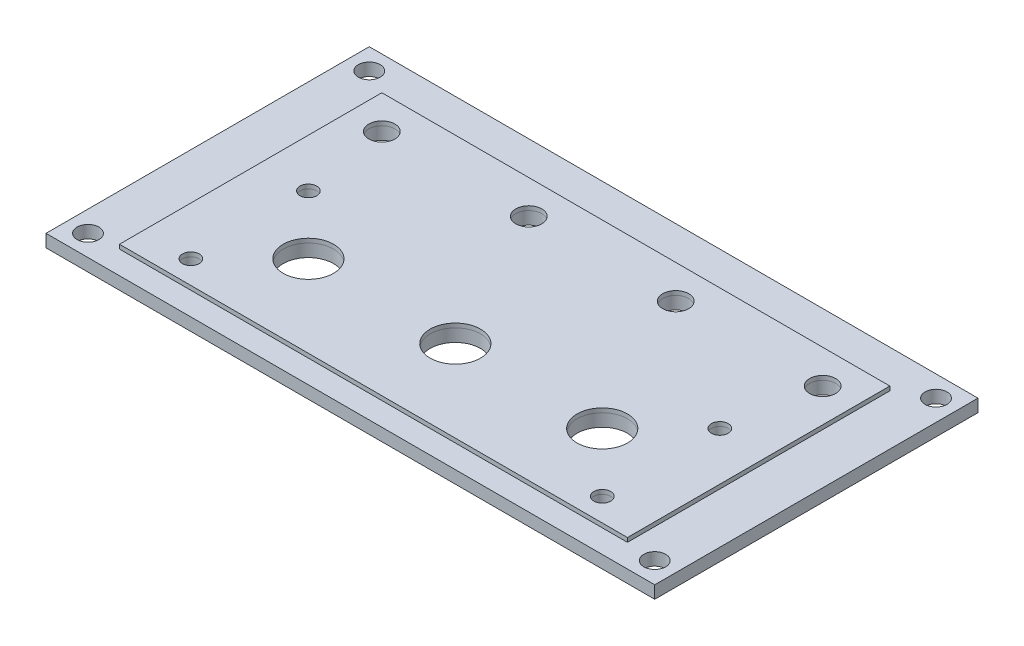
ISO-10303-21;
HEADER;
FILE_DESCRIPTION(('STEP AP214'),'2;1');
FILE_NAME('part.step','',(''),(''),'','','');
FILE_SCHEMA(('AUTOMOTIVE_DESIGN { 1 0 10303 214 1 1 1 1 }'));
ENDSEC;
DATA;
#1=APPLICATION_CONTEXT('core data for automotive mechanical design processes');
#2=APPLICATION_PROTOCOL_DEFINITION('international standard','automotive_design',2000,#1);
#3=PRODUCT_CONTEXT('',#1,'mechanical');
#4=PRODUCT('Part','Part','',(#3));
#5=PRODUCT_RELATED_PRODUCT_CATEGORY('part','',(#4));
#6=PRODUCT_DEFINITION_FORMATION('','',#4);
#7=PRODUCT_DEFINITION_CONTEXT('part definition',#1,'design');
#8=PRODUCT_DEFINITION('design','',#6,#7);
#9=PRODUCT_DEFINITION_SHAPE('','',#8);
#10=(LENGTH_UNIT() NAMED_UNIT(*) SI_UNIT(.MILLI.,.METRE.));
#11=(NAMED_UNIT(*) PLANE_ANGLE_UNIT() SI_UNIT($,.RADIAN.));
#12=(NAMED_UNIT(*) SI_UNIT($,.STERADIAN.) SOLID_ANGLE_UNIT());
#13=UNCERTAINTY_MEASURE_WITH_UNIT(LENGTH_MEASURE(1.E-05),#10,'distance_accuracy_value','');
#14=(GEOMETRIC_REPRESENTATION_CONTEXT(3) GLOBAL_UNCERTAINTY_ASSIGNED_CONTEXT((#13)) GLOBAL_UNIT_ASSIGNED_CONTEXT((#10,
#11,#12)) REPRESENTATION_CONTEXT('',''));
#15=CARTESIAN_POINT('',(0.,0.,0.));
#16=DIRECTION('',(0.,0.,1.));
#17=DIRECTION('',(1.,0.,0.));
#18=AXIS2_PLACEMENT_3D('',#15,#16,#17);
#19=CARTESIAN_POINT('',(0.,4.,0.));
#20=DIRECTION('',(0.,1.,0.));
#21=DIRECTION('',(0.,0.,1.));
#22=AXIS2_PLACEMENT_3D('',#19,#20,#21);
#23=PLANE('',#22);
#24=CARTESIAN_POINT('',(23.5,4.,-39.));
#25=DIRECTION('',(0.,1.,0.));
#26=DIRECTION('',(0.,0.,1.));
#27=AXIS2_PLACEMENT_3D('',#24,#25,#26);
#28=CIRCLE('',#27,2.);
#29=CARTESIAN_POINT('',(23.5,4.,-37.));
#30=VERTEX_POINT('',#29);
#31=EDGE_CURVE('E179',#30,#30,#28,.T.);
#32=ORIENTED_EDGE('',*,*,#31,.F.);
#33=EDGE_LOOP('',(#32));
#34=FACE_BOUND('',#33,.T.);
#35=CARTESIAN_POINT('',(72.5,4.,-25.));
#36=DIRECTION('',(0.,1.,0.));
#37=DIRECTION('',(0.,0.,1.));
#38=AXIS2_PLACEMENT_3D('',#35,#36,#37);
#39=CIRCLE('',#38,6.);
#40=CARTESIAN_POINT('',(72.5,4.,-19.));
#41=VERTEX_POINT('',#40);
#42=EDGE_CURVE('E167',#41,#41,#39,.T.);
#43=ORIENTED_EDGE('',*,*,#42,.F.);
#44=EDGE_LOOP('',(#43));
#45=FACE_BOUND('',#44,.T.);
#46=CARTESIAN_POINT('',(121.5,4.,-39.));
#47=DIRECTION('',(0.,1.,0.));
#48=DIRECTION('',(0.,0.,1.));
#49=AXIS2_PLACEMENT_3D('',#46,#47,#48);
#50=CIRCLE('',#49,1.99999999999999);
#51=CARTESIAN_POINT('',(121.5,4.,-37.));
#52=VERTEX_POINT('',#51);
#53=EDGE_CURVE('E155',#52,#52,#50,.T.);
#54=ORIENTED_EDGE('',*,*,#53,.F.);
#55=EDGE_LOOP('',(#54));
#56=FACE_BOUND('',#55,.T.);
#57=CARTESIAN_POINT('',(125.,4.,-60.));
#58=DIRECTION('',(0.,1.,0.));
#59=DIRECTION('',(0.,0.,1.));
#60=AXIS2_PLACEMENT_3D('',#57,#58,#59);
#61=CIRCLE('',#60,3.09999999999996);
#62=CARTESIAN_POINT('',(125.,4.,-56.9));
#63=VERTEX_POINT('',#62);
#64=EDGE_CURVE('E143',#63,#63,#61,.T.);
#65=ORIENTED_EDGE('',*,*,#64,.F.);
#66=EDGE_LOOP('',(#65));
#67=FACE_BOUND('',#66,.T.);
#68=CARTESIAN_POINT('',(55.,4.,-60.));
#69=DIRECTION('',(0.,1.,0.));
#70=DIRECTION('',(0.,0.,1.));
#71=AXIS2_PLACEMENT_3D('',#68,#69,#70);
#72=CIRCLE('',#71,3.1);
#73=CARTESIAN_POINT('',(55.,4.,-56.9));
#74=VERTEX_POINT('',#73);
#75=EDGE_CURVE('E131',#74,#74,#72,.T.);
#76=ORIENTED_EDGE('',*,*,#75,.F.);
#77=EDGE_LOOP('',(#76));
#78=FACE_BOUND('',#77,.T.);
#79=DIRECTION('',(0.,0.,1.));
#80=VECTOR('',#79,1.);
#81=CARTESIAN_POINT('',(12.,4.,-68.));
#82=LINE('',#81,#80);
#83=CARTESIAN_POINT('',(12.,4.,-68.));
#84=VERTEX_POINT('',#83);
#85=CARTESIAN_POINT('',(12.,4.,-5.5));
#86=VERTEX_POINT('',#85);
#87=EDGE_CURVE('E101',#84,#86,#82,.T.);
#88=ORIENTED_EDGE('',*,*,#87,.T.);
#89=DIRECTION('',(1.,0.,0.));
#90=VECTOR('',#89,1.);
#91=CARTESIAN_POINT('',(12.,4.,-5.5));
#92=LINE('',#91,#90);
#93=CARTESIAN_POINT('',(133.,4.,-5.5));
#94=VERTEX_POINT('',#93);
#95=EDGE_CURVE('E96',#86,#94,#92,.T.);
#96=ORIENTED_EDGE('',*,*,#95,.T.);
#97=DIRECTION('',(0.,0.,-1.));
#98=VECTOR('',#97,1.);
#99=CARTESIAN_POINT('',(133.,4.,-68.));
#100=LINE('',#99,#98);
#101=CARTESIAN_POINT('',(133.,4.,-68.));
#102=VERTEX_POINT('',#101);
#103=EDGE_CURVE('E99',#94,#102,#100,.T.);
#104=ORIENTED_EDGE('',*,*,#103,.T.);
#105=DIRECTION('',(-1.,0.,0.));
#106=VECTOR('',#105,1.);
#107=CARTESIAN_POINT('',(12.,4.,-68.));
#108=LINE('',#107,#106);
#109=EDGE_CURVE('E66',#102,#84,#108,.T.);
#110=ORIENTED_EDGE('',*,*,#109,.T.);
#111=EDGE_LOOP('',(#88,#96,#104,#110));
#112=FACE_BOUND('',#111,.T.);
#113=CARTESIAN_POINT('',(20.,4.,-60.));
#114=DIRECTION('',(0.,1.,0.));
#115=DIRECTION('',(0.,0.,1.));
#116=AXIS2_PLACEMENT_3D('',#113,#114,#115);
#117=CIRCLE('',#116,3.09999999999999);
#118=CARTESIAN_POINT('',(20.,4.,-56.9));
#119=VERTEX_POINT('',#118);
#120=EDGE_CURVE('E116',#119,#119,#117,.T.);
#121=ORIENTED_EDGE('',*,*,#120,.F.);
#122=EDGE_LOOP('',(#121));
#123=FACE_BOUND('',#122,.T.);
#124=CARTESIAN_POINT('',(90.,4.,-60.));
#125=DIRECTION('',(0.,1.,0.));
#126=DIRECTION('',(0.,0.,1.));
#127=AXIS2_PLACEMENT_3D('',#124,#125,#126);
#128=CIRCLE('',#127,3.09999999999999);
#129=CARTESIAN_POINT('',(90.,4.,-56.9));
#130=VERTEX_POINT('',#129);
#131=EDGE_CURVE('E137',#130,#130,#128,.T.);
#132=ORIENTED_EDGE('',*,*,#131,.F.);
#133=EDGE_LOOP('',(#132));
#134=FACE_BOUND('',#133,.T.);
#135=CARTESIAN_POINT('',(107.5,4.,-25.));
#136=DIRECTION('',(0.,1.,0.));
#137=DIRECTION('',(0.,0.,1.));
#138=AXIS2_PLACEMENT_3D('',#135,#136,#137);
#139=CIRCLE('',#138,6.00000000000002);
#140=CARTESIAN_POINT('',(107.5,4.,-19.));
#141=VERTEX_POINT('',#140);
#142=EDGE_CURVE('E149',#141,#141,#139,.T.);
#143=ORIENTED_EDGE('',*,*,#142,.F.);
#144=EDGE_LOOP('',(#143));
#145=FACE_BOUND('',#144,.T.);
#146=CARTESIAN_POINT('',(121.5,4.,-11.));
#147=DIRECTION('',(0.,1.,0.));
#148=DIRECTION('',(0.,0.,1.));
#149=AXIS2_PLACEMENT_3D('',#146,#147,#148);
#150=CIRCLE('',#149,2.);
#151=CARTESIAN_POINT('',(121.5,4.,-9.00000000000003));
#152=VERTEX_POINT('',#151);
#153=EDGE_CURVE('E161',#152,#152,#150,.T.);
#154=ORIENTED_EDGE('',*,*,#153,.F.);
#155=EDGE_LOOP('',(#154));
#156=FACE_BOUND('',#155,.T.);
#157=CARTESIAN_POINT('',(37.5,4.,-25.));
#158=DIRECTION('',(0.,1.,0.));
#159=DIRECTION('',(0.,0.,1.));
#160=AXIS2_PLACEMENT_3D('',#157,#158,#159);
#161=CIRCLE('',#160,6.);
#162=CARTESIAN_POINT('',(37.5,4.,-19.));
#163=VERTEX_POINT('',#162);
#164=EDGE_CURVE('E173',#163,#163,#161,.T.);
#165=ORIENTED_EDGE('',*,*,#164,.F.);
#166=EDGE_LOOP('',(#165));
#167=FACE_BOUND('',#166,.T.);
#168=CARTESIAN_POINT('',(23.5,4.,-11.));
#169=DIRECTION('',(0.,1.,0.));
#170=DIRECTION('',(0.,0.,1.));
#171=AXIS2_PLACEMENT_3D('',#168,#169,#170);
#172=CIRCLE('',#171,2.);
#173=CARTESIAN_POINT('',(23.5,4.,-9.00000000000001));
#174=VERTEX_POINT('',#173);
#175=EDGE_CURVE('E185',#174,#174,#172,.T.);
#176=ORIENTED_EDGE('',*,*,#175,.F.);
#177=EDGE_LOOP('',(#176));
#178=FACE_BOUND('',#177,.T.);
#179=ADVANCED_FACE('F49',(#34,#45,#56,#67,#78,#112,#123,#134,#145,#156,#167,#178),#23,.T.);
#180=CARTESIAN_POINT('',(0.,3.,0.));
#181=DIRECTION('',(0.,1.,0.));
#182=DIRECTION('',(0.,0.,1.));
#183=AXIS2_PLACEMENT_3D('',#180,#181,#182);
#184=PLANE('',#183);
#185=DIRECTION('',(0.,0.,1.));
#186=VECTOR('',#185,1.);
#187=CARTESIAN_POINT('',(12.,3.,-68.));
#188=LINE('',#187,#186);
#189=CARTESIAN_POINT('',(12.,3.,-68.));
#190=VERTEX_POINT('',#189);
#191=CARTESIAN_POINT('',(12.,3.,-5.5));
#192=VERTEX_POINT('',#191);
#193=EDGE_CURVE('E113',#190,#192,#188,.T.);
#194=ORIENTED_EDGE('',*,*,#193,.F.);
#195=DIRECTION('',(-1.,0.,0.));
#196=VECTOR('',#195,1.);
#197=CARTESIAN_POINT('',(12.,3.,-68.));
#198=LINE('',#197,#196);
#199=CARTESIAN_POINT('',(133.,3.,-68.));
#200=VERTEX_POINT('',#199);
#201=EDGE_CURVE('E89',#200,#190,#198,.T.);
#202=ORIENTED_EDGE('',*,*,#201,.F.);
#203=DIRECTION('',(0.,0.,-1.));
#204=VECTOR('',#203,1.);
#205=CARTESIAN_POINT('',(133.,3.,-68.));
#206=LINE('',#205,#204);
#207=CARTESIAN_POINT('',(133.,3.,-5.5));
#208=VERTEX_POINT('',#207);
#209=EDGE_CURVE('E83',#208,#200,#206,.T.);
#210=ORIENTED_EDGE('',*,*,#209,.F.);
#211=DIRECTION('',(1.,0.,0.));
#212=VECTOR('',#211,1.);
#213=CARTESIAN_POINT('',(12.,3.,-5.5));
#214=LINE('',#213,#212);
#215=EDGE_CURVE('E105',#192,#208,#214,.T.);
#216=ORIENTED_EDGE('',*,*,#215,.F.);
#217=EDGE_LOOP('',(#194,#202,#210,#216));
#218=FACE_BOUND('',#217,.T.);
#219=CARTESIAN_POINT('',(20.,3.,-60.));
#220=DIRECTION('',(0.,1.,0.));
#221=DIRECTION('',(0.,0.,1.));
#222=AXIS2_PLACEMENT_3D('',#219,#220,#221);
#223=CIRCLE('',#222,3.09999999999999);
#224=CARTESIAN_POINT('',(20.,3.,-56.9));
#225=VERTEX_POINT('',#224);
#226=EDGE_CURVE('E128',#225,#225,#223,.T.);
#227=ORIENTED_EDGE('',*,*,#226,.T.);
#228=EDGE_LOOP('',(#227));
#229=FACE_BOUND('',#228,.T.);
#230=CARTESIAN_POINT('',(55.,3.,-60.));
#231=DIRECTION('',(0.,1.,0.));
#232=DIRECTION('',(0.,0.,1.));
#233=AXIS2_PLACEMENT_3D('',#230,#231,#232);
#234=CIRCLE('',#233,3.1);
#235=CARTESIAN_POINT('',(55.,3.,-56.9));
#236=VERTEX_POINT('',#235);
#237=EDGE_CURVE('E134',#236,#236,#234,.T.);
#238=ORIENTED_EDGE('',*,*,#237,.T.);
#239=EDGE_LOOP('',(#238));
#240=FACE_BOUND('',#239,.T.);
#241=CARTESIAN_POINT('',(90.,3.,-60.));
#242=DIRECTION('',(0.,1.,0.));
#243=DIRECTION('',(0.,0.,1.));
#244=AXIS2_PLACEMENT_3D('',#241,#242,#243);
#245=CIRCLE('',#244,3.09999999999999);
#246=CARTESIAN_POINT('',(90.,3.,-56.9));
#247=VERTEX_POINT('',#246);
#248=EDGE_CURVE('E140',#247,#247,#245,.T.);
#249=ORIENTED_EDGE('',*,*,#248,.T.);
#250=EDGE_LOOP('',(#249));
#251=FACE_BOUND('',#250,.T.);
#252=CARTESIAN_POINT('',(125.,3.,-60.));
#253=DIRECTION('',(0.,1.,0.));
#254=DIRECTION('',(0.,0.,1.));
#255=AXIS2_PLACEMENT_3D('',#252,#253,#254);
#256=CIRCLE('',#255,3.09999999999996);
#257=CARTESIAN_POINT('',(125.,3.,-56.9));
#258=VERTEX_POINT('',#257);
#259=EDGE_CURVE('E146',#258,#258,#256,.T.);
#260=ORIENTED_EDGE('',*,*,#259,.T.);
#261=EDGE_LOOP('',(#260));
#262=FACE_BOUND('',#261,.T.);
#263=CARTESIAN_POINT('',(107.5,3.,-25.));
#264=DIRECTION('',(0.,1.,0.));
#265=DIRECTION('',(0.,0.,1.));
#266=AXIS2_PLACEMENT_3D('',#263,#264,#265);
#267=CIRCLE('',#266,6.00000000000002);
#268=CARTESIAN_POINT('',(107.5,3.,-19.));
#269=VERTEX_POINT('',#268);
#270=EDGE_CURVE('E152',#269,#269,#267,.T.);
#271=ORIENTED_EDGE('',*,*,#270,.T.);
#272=EDGE_LOOP('',(#271));
#273=FACE_BOUND('',#272,.T.);
#274=CARTESIAN_POINT('',(121.5,3.,-39.));
#275=DIRECTION('',(0.,1.,0.));
#276=DIRECTION('',(0.,0.,1.));
#277=AXIS2_PLACEMENT_3D('',#274,#275,#276);
#278=CIRCLE('',#277,1.99999999999999);
#279=CARTESIAN_POINT('',(121.5,3.,-37.));
#280=VERTEX_POINT('',#279);
#281=EDGE_CURVE('E158',#280,#280,#278,.T.);
#282=ORIENTED_EDGE('',*,*,#281,.T.);
#283=EDGE_LOOP('',(#282));
#284=FACE_BOUND('',#283,.T.);
#285=CARTESIAN_POINT('',(121.5,3.,-11.));
#286=DIRECTION('',(0.,1.,0.));
#287=DIRECTION('',(0.,0.,1.));
#288=AXIS2_PLACEMENT_3D('',#285,#286,#287);
#289=CIRCLE('',#288,2.);
#290=CARTESIAN_POINT('',(121.5,3.,-9.00000000000003));
#291=VERTEX_POINT('',#290);
#292=EDGE_CURVE('E164',#291,#291,#289,.T.);
#293=ORIENTED_EDGE('',*,*,#292,.T.);
#294=EDGE_LOOP('',(#293));
#295=FACE_BOUND('',#294,.T.);
#296=CARTESIAN_POINT('',(72.5,3.,-25.));
#297=DIRECTION('',(0.,1.,0.));
#298=DIRECTION('',(0.,0.,1.));
#299=AXIS2_PLACEMENT_3D('',#296,#297,#298);
#300=CIRCLE('',#299,6.);
#301=CARTESIAN_POINT('',(72.5,3.,-19.));
#302=VERTEX_POINT('',#301);
#303=EDGE_CURVE('E170',#302,#302,#300,.T.);
#304=ORIENTED_EDGE('',*,*,#303,.T.);
#305=EDGE_LOOP('',(#304));
#306=FACE_BOUND('',#305,.T.);
#307=CARTESIAN_POINT('',(37.5,3.,-25.));
#308=DIRECTION('',(0.,1.,0.));
#309=DIRECTION('',(0.,0.,1.));
#310=AXIS2_PLACEMENT_3D('',#307,#308,#309);
#311=CIRCLE('',#310,6.);
#312=CARTESIAN_POINT('',(37.5,3.,-19.));
#313=VERTEX_POINT('',#312);
#314=EDGE_CURVE('E176',#313,#313,#311,.T.);
#315=ORIENTED_EDGE('',*,*,#314,.T.);
#316=EDGE_LOOP('',(#315));
#317=FACE_BOUND('',#316,.T.);
#318=CARTESIAN_POINT('',(23.5,3.,-39.));
#319=DIRECTION('',(0.,1.,0.));
#320=DIRECTION('',(0.,0.,1.));
#321=AXIS2_PLACEMENT_3D('',#318,#319,#320);
#322=CIRCLE('',#321,2.);
#323=CARTESIAN_POINT('',(23.5,3.,-37.));
#324=VERTEX_POINT('',#323);
#325=EDGE_CURVE('E182',#324,#324,#322,.T.);
#326=ORIENTED_EDGE('',*,*,#325,.T.);
#327=EDGE_LOOP('',(#326));
#328=FACE_BOUND('',#327,.T.);
#329=CARTESIAN_POINT('',(23.5,3.,-11.));
#330=DIRECTION('',(0.,1.,0.));
#331=DIRECTION('',(0.,0.,1.));
#332=AXIS2_PLACEMENT_3D('',#329,#330,#331);
#333=CIRCLE('',#332,2.);
#334=CARTESIAN_POINT('',(23.5,3.,-9.00000000000001));
#335=VERTEX_POINT('',#334);
#336=EDGE_CURVE('E188',#335,#335,#333,.T.);
#337=ORIENTED_EDGE('',*,*,#336,.T.);
#338=EDGE_LOOP('',(#337));
#339=FACE_BOUND('',#338,.T.);
#340=ADVANCED_FACE('F124',(#218,#229,#240,#251,#262,#273,#284,#295,#306,#317,#328,#339),#184,.F.);
#341=CARTESIAN_POINT('',(12.,4.,-68.));
#342=DIRECTION('',(1.,0.,0.));
#343=DIRECTION('',(0.,0.,-1.));
#344=AXIS2_PLACEMENT_3D('',#341,#342,#343);
#345=PLANE('',#344);
#346=ORIENTED_EDGE('',*,*,#193,.T.);
#347=DIRECTION('',(0.,-1.,0.));
#348=VECTOR('',#347,1.);
#349=CARTESIAN_POINT('',(12.,4.,-5.5));
#350=LINE('',#349,#348);
#351=EDGE_CURVE('E12',#86,#192,#350,.T.);
#352=ORIENTED_EDGE('',*,*,#351,.F.);
#353=ORIENTED_EDGE('',*,*,#87,.F.);
#354=DIRECTION('',(0.,-1.,0.));
#355=VECTOR('',#354,1.);
#356=CARTESIAN_POINT('',(12.,4.,-68.));
#357=LINE('',#356,#355);
#358=EDGE_CURVE('E109',#84,#190,#357,.T.);
#359=ORIENTED_EDGE('',*,*,#358,.T.);
#360=EDGE_LOOP('',(#346,#352,#353,#359));
#361=FACE_BOUND('',#360,.T.);
#362=ADVANCED_FACE('F51',(#361),#345,.F.);
#363=CARTESIAN_POINT('',(12.,4.,-5.5));
#364=DIRECTION('',(0.,0.,-1.));
#365=DIRECTION('',(-1.,0.,0.));
#366=AXIS2_PLACEMENT_3D('',#363,#364,#365);
#367=PLANE('',#366);
#368=ORIENTED_EDGE('',*,*,#215,.T.);
#369=DIRECTION('',(0.,-1.,0.));
#370=VECTOR('',#369,1.);
#371=CARTESIAN_POINT('',(133.,4.,-5.5));
#372=LINE('',#371,#370);
#373=EDGE_CURVE('E58',#94,#208,#372,.T.);
#374=ORIENTED_EDGE('',*,*,#373,.F.);
#375=ORIENTED_EDGE('',*,*,#95,.F.);
#376=ORIENTED_EDGE('',*,*,#351,.T.);
#377=EDGE_LOOP('',(#368,#374,#375,#376));
#378=FACE_BOUND('',#377,.T.);
#379=ADVANCED_FACE('F104',(#378),#367,.F.);
#380=CARTESIAN_POINT('',(133.,4.,-68.));
#381=DIRECTION('',(-1.,0.,0.));
#382=DIRECTION('',(0.,0.,1.));
#383=AXIS2_PLACEMENT_3D('',#380,#381,#382);
#384=PLANE('',#383);
#385=ORIENTED_EDGE('',*,*,#209,.T.);
#386=DIRECTION('',(0.,-1.,0.));
#387=VECTOR('',#386,1.);
#388=CARTESIAN_POINT('',(133.,4.,-68.));
#389=LINE('',#388,#387);
#390=EDGE_CURVE('E106',#102,#200,#389,.T.);
#391=ORIENTED_EDGE('',*,*,#390,.F.);
#392=ORIENTED_EDGE('',*,*,#103,.F.);
#393=ORIENTED_EDGE('',*,*,#373,.T.);
#394=EDGE_LOOP('',(#385,#391,#392,#393));
#395=FACE_BOUND('',#394,.T.);
#396=ADVANCED_FACE('F107',(#395),#384,.F.);
#397=CARTESIAN_POINT('',(12.,4.,-68.));
#398=DIRECTION('',(0.,0.,1.));
#399=DIRECTION('',(1.,0.,0.));
#400=AXIS2_PLACEMENT_3D('',#397,#398,#399);
#401=PLANE('',#400);
#402=ORIENTED_EDGE('',*,*,#201,.T.);
#403=ORIENTED_EDGE('',*,*,#358,.F.);
#404=ORIENTED_EDGE('',*,*,#109,.F.);
#405=ORIENTED_EDGE('',*,*,#390,.T.);
#406=EDGE_LOOP('',(#402,#403,#404,#405));
#407=FACE_BOUND('',#406,.T.);
#408=ADVANCED_FACE('F121',(#407),#401,.F.);
#409=CARTESIAN_POINT('',(20.,4.,-60.));
#410=DIRECTION('',(0.,-1.,0.));
#411=DIRECTION('',(0.,0.,-1.));
#412=AXIS2_PLACEMENT_3D('',#409,#410,#411);
#413=CYLINDRICAL_SURFACE('',#412,3.09999999999999);
#414=ORIENTED_EDGE('',*,*,#120,.T.);
#415=EDGE_LOOP('',(#414));
#416=FACE_BOUND('',#415,.T.);
#417=ORIENTED_EDGE('',*,*,#226,.F.);
#418=EDGE_LOOP('',(#417));
#419=FACE_BOUND('',#418,.T.);
#420=ADVANCED_FACE('F207',(#416,#419),#413,.F.);
#421=CARTESIAN_POINT('',(55.,4.,-60.));
#422=DIRECTION('',(0.,-1.,0.));
#423=DIRECTION('',(0.,0.,-1.));
#424=AXIS2_PLACEMENT_3D('',#421,#422,#423);
#425=CYLINDRICAL_SURFACE('',#424,3.1);
#426=ORIENTED_EDGE('',*,*,#75,.T.);
#427=EDGE_LOOP('',(#426));
#428=FACE_BOUND('',#427,.T.);
#429=ORIENTED_EDGE('',*,*,#237,.F.);
#430=EDGE_LOOP('',(#429));
#431=FACE_BOUND('',#430,.T.);
#432=ADVANCED_FACE('F253',(#428,#431),#425,.F.);
#433=CARTESIAN_POINT('',(90.,4.,-60.));
#434=DIRECTION('',(0.,-1.,0.));
#435=DIRECTION('',(0.,0.,-1.));
#436=AXIS2_PLACEMENT_3D('',#433,#434,#435);
#437=CYLINDRICAL_SURFACE('',#436,3.09999999999999);
#438=ORIENTED_EDGE('',*,*,#131,.T.);
#439=EDGE_LOOP('',(#438));
#440=FACE_BOUND('',#439,.T.);
#441=ORIENTED_EDGE('',*,*,#248,.F.);
#442=EDGE_LOOP('',(#441));
#443=FACE_BOUND('',#442,.T.);
#444=ADVANCED_FACE('F261',(#440,#443),#437,.F.);
#445=CARTESIAN_POINT('',(125.,4.,-60.));
#446=DIRECTION('',(0.,-1.,0.));
#447=DIRECTION('',(0.,0.,-1.));
#448=AXIS2_PLACEMENT_3D('',#445,#446,#447);
#449=CYLINDRICAL_SURFACE('',#448,3.09999999999996);
#450=ORIENTED_EDGE('',*,*,#64,.T.);
#451=EDGE_LOOP('',(#450));
#452=FACE_BOUND('',#451,.T.);
#453=ORIENTED_EDGE('',*,*,#259,.F.);
#454=EDGE_LOOP('',(#453));
#455=FACE_BOUND('',#454,.T.);
#456=ADVANCED_FACE('F269',(#452,#455),#449,.F.);
#457=CARTESIAN_POINT('',(107.5,4.,-25.));
#458=DIRECTION('',(0.,-1.,0.));
#459=DIRECTION('',(0.,0.,-1.));
#460=AXIS2_PLACEMENT_3D('',#457,#458,#459);
#461=CYLINDRICAL_SURFACE('',#460,6.00000000000002);
#462=ORIENTED_EDGE('',*,*,#142,.T.);
#463=EDGE_LOOP('',(#462));
#464=FACE_BOUND('',#463,.T.);
#465=ORIENTED_EDGE('',*,*,#270,.F.);
#466=EDGE_LOOP('',(#465));
#467=FACE_BOUND('',#466,.T.);
#468=ADVANCED_FACE('F278',(#464,#467),#461,.F.);
#469=CARTESIAN_POINT('',(121.5,4.,-39.));
#470=DIRECTION('',(0.,-1.,0.));
#471=DIRECTION('',(0.,0.,-1.));
#472=AXIS2_PLACEMENT_3D('',#469,#470,#471);
#473=CYLINDRICAL_SURFACE('',#472,1.99999999999999);
#474=ORIENTED_EDGE('',*,*,#53,.T.);
#475=EDGE_LOOP('',(#474));
#476=FACE_BOUND('',#475,.T.);
#477=ORIENTED_EDGE('',*,*,#281,.F.);
#478=EDGE_LOOP('',(#477));
#479=FACE_BOUND('',#478,.T.);
#480=ADVANCED_FACE('F287',(#476,#479),#473,.F.);
#481=CARTESIAN_POINT('',(121.5,4.,-11.));
#482=DIRECTION('',(0.,-1.,0.));
#483=DIRECTION('',(0.,0.,-1.));
#484=AXIS2_PLACEMENT_3D('',#481,#482,#483);
#485=CYLINDRICAL_SURFACE('',#484,2.);
#486=ORIENTED_EDGE('',*,*,#153,.T.);
#487=EDGE_LOOP('',(#486));
#488=FACE_BOUND('',#487,.T.);
#489=ORIENTED_EDGE('',*,*,#292,.F.);
#490=EDGE_LOOP('',(#489));
#491=FACE_BOUND('',#490,.T.);
#492=ADVANCED_FACE('F296',(#488,#491),#485,.F.);
#493=CARTESIAN_POINT('',(72.5,4.,-25.));
#494=DIRECTION('',(0.,-1.,0.));
#495=DIRECTION('',(0.,0.,-1.));
#496=AXIS2_PLACEMENT_3D('',#493,#494,#495);
#497=CYLINDRICAL_SURFACE('',#496,6.);
#498=ORIENTED_EDGE('',*,*,#42,.T.);
#499=EDGE_LOOP('',(#498));
#500=FACE_BOUND('',#499,.T.);
#501=ORIENTED_EDGE('',*,*,#303,.F.);
#502=EDGE_LOOP('',(#501));
#503=FACE_BOUND('',#502,.T.);
#504=ADVANCED_FACE('F305',(#500,#503),#497,.F.);
#505=CARTESIAN_POINT('',(37.5,4.,-25.));
#506=DIRECTION('',(0.,-1.,0.));
#507=DIRECTION('',(0.,0.,-1.));
#508=AXIS2_PLACEMENT_3D('',#505,#506,#507);
#509=CYLINDRICAL_SURFACE('',#508,6.);
#510=ORIENTED_EDGE('',*,*,#164,.T.);
#511=EDGE_LOOP('',(#510));
#512=FACE_BOUND('',#511,.T.);
#513=ORIENTED_EDGE('',*,*,#314,.F.);
#514=EDGE_LOOP('',(#513));
#515=FACE_BOUND('',#514,.T.);
#516=ADVANCED_FACE('F314',(#512,#515),#509,.F.);
#517=CARTESIAN_POINT('',(23.5,4.,-39.));
#518=DIRECTION('',(0.,-1.,0.));
#519=DIRECTION('',(0.,0.,-1.));
#520=AXIS2_PLACEMENT_3D('',#517,#518,#519);
#521=CYLINDRICAL_SURFACE('',#520,2.);
#522=ORIENTED_EDGE('',*,*,#31,.T.);
#523=EDGE_LOOP('',(#522));
#524=FACE_BOUND('',#523,.T.);
#525=ORIENTED_EDGE('',*,*,#325,.F.);
#526=EDGE_LOOP('',(#525));
#527=FACE_BOUND('',#526,.T.);
#528=ADVANCED_FACE('F323',(#524,#527),#521,.F.);
#529=CARTESIAN_POINT('',(23.5,4.,-11.));
#530=DIRECTION('',(0.,-1.,0.));
#531=DIRECTION('',(0.,0.,-1.));
#532=AXIS2_PLACEMENT_3D('',#529,#530,#531);
#533=CYLINDRICAL_SURFACE('',#532,2.);
#534=ORIENTED_EDGE('',*,*,#175,.T.);
#535=EDGE_LOOP('',(#534));
#536=FACE_BOUND('',#535,.T.);
#537=ORIENTED_EDGE('',*,*,#336,.F.);
#538=EDGE_LOOP('',(#537));
#539=FACE_BOUND('',#538,.T.);
#540=ADVANCED_FACE('F194',(#536,#539),#533,.F.);
#541=CLOSED_SHELL('',(#179,#340,#362,#379,#396,#408,#420,#432,#444,#456,#468,#480,#492,#504,
#516,#528,#540));
#542=MANIFOLD_SOLID_BREP('B2',#541);
#543=CARTESIAN_POINT('',(0.,3.,0.));
#544=DIRECTION('',(0.,0.,-1.));
#545=DIRECTION('',(-1.,0.,0.));
#546=AXIS2_PLACEMENT_3D('',#543,#544,#545);
#547=PLANE('',#546);
#548=DIRECTION('',(1.,0.,0.));
#549=VECTOR('',#548,1.);
#550=CARTESIAN_POINT('',(0.,0.,0.));
#551=LINE('',#550,#549);
#552=CARTESIAN_POINT('',(0.,0.,0.));
#553=VERTEX_POINT('',#552);
#554=CARTESIAN_POINT('',(145.,0.,0.));
#555=VERTEX_POINT('',#554);
#556=EDGE_CURVE('E514',#553,#555,#551,.T.);
#557=ORIENTED_EDGE('',*,*,#556,.T.);
#558=DIRECTION('',(0.,-1.,0.));
#559=VECTOR('',#558,1.);
#560=CARTESIAN_POINT('',(145.,3.,0.));
#561=LINE('',#560,#559);
#562=CARTESIAN_POINT('',(145.,3.,0.));
#563=VERTEX_POINT('',#562);
#564=EDGE_CURVE('E47',#563,#555,#561,.T.);
#565=ORIENTED_EDGE('',*,*,#564,.F.);
#566=DIRECTION('',(1.,0.,0.));
#567=VECTOR('',#566,1.);
#568=CARTESIAN_POINT('',(0.,3.,0.));
#569=LINE('',#568,#567);
#570=CARTESIAN_POINT('',(0.,3.,0.));
#571=VERTEX_POINT('',#570);
#572=EDGE_CURVE('E455',#571,#563,#569,.T.);
#573=ORIENTED_EDGE('',*,*,#572,.F.);
#574=DIRECTION('',(0.,-1.,0.));
#575=VECTOR('',#574,1.);
#576=CARTESIAN_POINT('',(0.,3.,0.));
#577=LINE('',#576,#575);
#578=EDGE_CURVE('E421',#571,#553,#577,.T.);
#579=ORIENTED_EDGE('',*,*,#578,.T.);
#580=EDGE_LOOP('',(#557,#565,#573,#579));
#581=FACE_BOUND('',#580,.T.);
#582=ADVANCED_FACE('F404',(#581),#547,.F.);
#583=CARTESIAN_POINT('',(145.,3.,0.));
#584=DIRECTION('',(-1.,0.,0.));
#585=DIRECTION('',(0.,0.,1.));
#586=AXIS2_PLACEMENT_3D('',#583,#584,#585);
#587=PLANE('',#586);
#588=DIRECTION('',(0.,0.,-1.));
#589=VECTOR('',#588,1.);
#590=CARTESIAN_POINT('',(145.,0.,0.));
#591=LINE('',#590,#589);
#592=CARTESIAN_POINT('',(145.,0.,-77.));
#593=VERTEX_POINT('',#592);
#594=EDGE_CURVE('E460',#555,#593,#591,.T.);
#595=ORIENTED_EDGE('',*,*,#594,.T.);
#596=DIRECTION('',(0.,-1.,0.));
#597=VECTOR('',#596,1.);
#598=CARTESIAN_POINT('',(145.,3.,-77.));
#599=LINE('',#598,#597);
#600=CARTESIAN_POINT('',(145.,3.,-77.));
#601=VERTEX_POINT('',#600);
#602=EDGE_CURVE('E413',#601,#593,#599,.T.);
#603=ORIENTED_EDGE('',*,*,#602,.F.);
#604=DIRECTION('',(0.,0.,-1.));
#605=VECTOR('',#604,1.);
#606=CARTESIAN_POINT('',(145.,3.,0.));
#607=LINE('',#606,#605);
#608=EDGE_CURVE('E446',#563,#601,#607,.T.);
#609=ORIENTED_EDGE('',*,*,#608,.F.);
#610=ORIENTED_EDGE('',*,*,#564,.T.);
#611=EDGE_LOOP('',(#595,#603,#609,#610));
#612=FACE_BOUND('',#611,.T.);
#613=ADVANCED_FACE('F459',(#612),#587,.F.);
#614=CARTESIAN_POINT('',(0.,3.,-77.));
#615=DIRECTION('',(0.,0.,-1.));
#616=DIRECTION('',(-1.,0.,0.));
#617=AXIS2_PLACEMENT_3D('',#614,#615,#616);
#618=PLANE('',#617);
#619=DIRECTION('',(1.,0.,0.));
#620=VECTOR('',#619,1.);
#621=CARTESIAN_POINT('',(0.,0.,-77.));
#622=LINE('',#621,#620);
#623=CARTESIAN_POINT('',(0.,0.,-77.));
#624=VERTEX_POINT('',#623);
#625=EDGE_CURVE('E517',#624,#593,#622,.T.);
#626=ORIENTED_EDGE('',*,*,#625,.F.);
#627=DIRECTION('',(0.,-1.,0.));
#628=VECTOR('',#627,1.);
#629=CARTESIAN_POINT('',(0.,3.,-77.));
#630=LINE('',#629,#628);
#631=CARTESIAN_POINT('',(0.,3.,-77.));
#632=VERTEX_POINT('',#631);
#633=EDGE_CURVE('E435',#632,#624,#630,.T.);
#634=ORIENTED_EDGE('',*,*,#633,.F.);
#635=DIRECTION('',(1.,0.,0.));
#636=VECTOR('',#635,1.);
#637=CARTESIAN_POINT('',(0.,3.,-77.));
#638=LINE('',#637,#636);
#639=EDGE_CURVE('E454',#632,#601,#638,.T.);
#640=ORIENTED_EDGE('',*,*,#639,.T.);
#641=ORIENTED_EDGE('',*,*,#602,.T.);
#642=EDGE_LOOP('',(#626,#634,#640,#641));
#643=FACE_BOUND('',#642,.T.);
#644=ADVANCED_FACE('F463',(#643),#618,.T.);
#645=CARTESIAN_POINT('',(90.,3.,-60.));
#646=DIRECTION('',(0.,-1.,0.));
#647=DIRECTION('',(0.,0.,-1.));
#648=AXIS2_PLACEMENT_3D('',#645,#646,#647);
#649=CYLINDRICAL_SURFACE('',#648,3.1);
#650=CARTESIAN_POINT('',(90.,3.,-60.));
#651=DIRECTION('',(0.,1.,0.));
#652=DIRECTION('',(0.,0.,1.));
#653=AXIS2_PLACEMENT_3D('',#650,#651,#652);
#654=CIRCLE('',#653,3.1);
#655=CARTESIAN_POINT('',(90.,3.,-56.9));
#656=VERTEX_POINT('',#655);
#657=EDGE_CURVE('E475',#656,#656,#654,.T.);
#658=ORIENTED_EDGE('',*,*,#657,.T.);
#659=EDGE_LOOP('',(#658));
#660=FACE_BOUND('',#659,.T.);
#661=CARTESIAN_POINT('',(90.,0.,-60.));
#662=DIRECTION('',(0.,1.,0.));
#663=DIRECTION('',(0.,0.,1.));
#664=AXIS2_PLACEMENT_3D('',#661,#662,#663);
#665=CIRCLE('',#664,3.1);
#666=CARTESIAN_POINT('',(90.,0.,-56.9));
#667=VERTEX_POINT('',#666);
#668=EDGE_CURVE('E528',#667,#667,#665,.T.);
#669=ORIENTED_EDGE('',*,*,#668,.F.);
#670=EDGE_LOOP('',(#669));
#671=FACE_BOUND('',#670,.T.);
#672=ADVANCED_FACE('F669',(#660,#671),#649,.F.);
#673=CARTESIAN_POINT('',(55.,3.,-60.));
#674=DIRECTION('',(0.,-1.,0.));
#675=DIRECTION('',(0.,0.,-1.));
#676=AXIS2_PLACEMENT_3D('',#673,#674,#675);
#677=CYLINDRICAL_SURFACE('',#676,3.1);
#678=CARTESIAN_POINT('',(55.,3.,-60.));
#679=DIRECTION('',(0.,1.,0.));
#680=DIRECTION('',(0.,0.,1.));
#681=AXIS2_PLACEMENT_3D('',#678,#679,#680);
#682=CIRCLE('',#681,3.1);
#683=CARTESIAN_POINT('',(55.,3.,-56.9));
#684=VERTEX_POINT('',#683);
#685=EDGE_CURVE('E472',#684,#684,#682,.T.);
#686=ORIENTED_EDGE('',*,*,#685,.T.);
#687=EDGE_LOOP('',(#686));
#688=FACE_BOUND('',#687,.T.);
#689=CARTESIAN_POINT('',(55.,0.,-60.));
#690=DIRECTION('',(0.,1.,0.));
#691=DIRECTION('',(0.,0.,1.));
#692=AXIS2_PLACEMENT_3D('',#689,#690,#691);
#693=CIRCLE('',#692,3.1);
#694=CARTESIAN_POINT('',(55.,0.,-56.9));
#695=VERTEX_POINT('',#694);
#696=EDGE_CURVE('E525',#695,#695,#693,.T.);
#697=ORIENTED_EDGE('',*,*,#696,.F.);
#698=EDGE_LOOP('',(#697));
#699=FACE_BOUND('',#698,.T.);
#700=ADVANCED_FACE('F671',(#688,#699),#677,.F.);
#701=CARTESIAN_POINT('',(20.,3.,-60.));
#702=DIRECTION('',(0.,-1.,0.));
#703=DIRECTION('',(0.,0.,-1.));
#704=AXIS2_PLACEMENT_3D('',#701,#702,#703);
#705=CYLINDRICAL_SURFACE('',#704,3.1);
#706=CARTESIAN_POINT('',(20.,3.,-60.));
#707=DIRECTION('',(0.,1.,0.));
#708=DIRECTION('',(0.,0.,1.));
#709=AXIS2_PLACEMENT_3D('',#706,#707,#708);
#710=CIRCLE('',#709,3.1);
#711=CARTESIAN_POINT('',(20.,3.,-56.9));
#712=VERTEX_POINT('',#711);
#713=EDGE_CURVE('E466',#712,#712,#710,.T.);
#714=ORIENTED_EDGE('',*,*,#713,.T.);
#715=EDGE_LOOP('',(#714));
#716=FACE_BOUND('',#715,.T.);
#717=CARTESIAN_POINT('',(20.,0.,-60.));
#718=DIRECTION('',(0.,1.,0.));
#719=DIRECTION('',(0.,0.,1.));
#720=AXIS2_PLACEMENT_3D('',#717,#718,#719);
#721=CIRCLE('',#720,3.1);
#722=CARTESIAN_POINT('',(20.,0.,-56.9));
#723=VERTEX_POINT('',#722);
#724=EDGE_CURVE('E522',#723,#723,#721,.T.);
#725=ORIENTED_EDGE('',*,*,#724,.F.);
#726=EDGE_LOOP('',(#725));
#727=FACE_BOUND('',#726,.T.);
#728=ADVANCED_FACE('F678',(#716,#727),#705,.F.);
#729=CARTESIAN_POINT('',(0.,3.,0.));
#730=DIRECTION('',(-1.,0.,0.));
#731=DIRECTION('',(0.,0.,1.));
#732=AXIS2_PLACEMENT_3D('',#729,#730,#731);
#733=PLANE('',#732);
#734=DIRECTION('',(0.,0.,-1.));
#735=VECTOR('',#734,1.);
#736=CARTESIAN_POINT('',(0.,0.,0.));
#737=LINE('',#736,#735);
#738=EDGE_CURVE('E519',#553,#624,#737,.T.);
#739=ORIENTED_EDGE('',*,*,#738,.F.);
#740=ORIENTED_EDGE('',*,*,#578,.F.);
#741=DIRECTION('',(0.,0.,-1.));
#742=VECTOR('',#741,1.);
#743=CARTESIAN_POINT('',(0.,3.,0.));
#744=LINE('',#743,#742);
#745=EDGE_CURVE('E464',#571,#632,#744,.T.);
#746=ORIENTED_EDGE('',*,*,#745,.T.);
#747=ORIENTED_EDGE('',*,*,#633,.T.);
#748=EDGE_LOOP('',(#739,#740,#746,#747));
#749=FACE_BOUND('',#748,.T.);
#750=ADVANCED_FACE('F602',(#749),#733,.T.);
#751=CARTESIAN_POINT('',(5.,3.,-72.));
#752=DIRECTION('',(0.,-1.,0.));
#753=DIRECTION('',(0.,0.,-1.));
#754=AXIS2_PLACEMENT_3D('',#751,#752,#753);
#755=CYLINDRICAL_SURFACE('',#754,2.6);
#756=CARTESIAN_POINT('',(5.,3.,-72.));
#757=DIRECTION('',(0.,1.,0.));
#758=DIRECTION('',(0.,0.,1.));
#759=AXIS2_PLACEMENT_3D('',#756,#757,#758);
#760=CIRCLE('',#759,2.6);
#761=CARTESIAN_POINT('',(5.,3.,-69.4));
#762=VERTEX_POINT('',#761);
#763=EDGE_CURVE('E570',#762,#762,#760,.T.);
#764=ORIENTED_EDGE('',*,*,#763,.T.);
#765=EDGE_LOOP('',(#764));
#766=FACE_BOUND('',#765,.T.);
#767=CARTESIAN_POINT('',(5.,0.,-72.));
#768=DIRECTION('',(0.,1.,0.));
#769=DIRECTION('',(0.,0.,1.));
#770=AXIS2_PLACEMENT_3D('',#767,#768,#769);
#771=CIRCLE('',#770,2.6);
#772=CARTESIAN_POINT('',(5.,0.,-69.4));
#773=VERTEX_POINT('',#772);
#774=EDGE_CURVE('E511',#773,#773,#771,.T.);
#775=ORIENTED_EDGE('',*,*,#774,.F.);
#776=EDGE_LOOP('',(#775));
#777=FACE_BOUND('',#776,.T.);
#778=ADVANCED_FACE('F574',(#766,#777),#755,.F.);
#779=CARTESIAN_POINT('',(5.,3.,-5.));
#780=DIRECTION('',(0.,-1.,0.));
#781=DIRECTION('',(0.,0.,-1.));
#782=AXIS2_PLACEMENT_3D('',#779,#780,#781);
#783=CYLINDRICAL_SURFACE('',#782,2.6);
#784=CARTESIAN_POINT('',(5.,3.,-5.));
#785=DIRECTION('',(0.,1.,0.));
#786=DIRECTION('',(0.,0.,1.));
#787=AXIS2_PLACEMENT_3D('',#784,#785,#786);
#788=CIRCLE('',#787,2.6);
#789=CARTESIAN_POINT('',(5.,3.,-2.4));
#790=VERTEX_POINT('',#789);
#791=EDGE_CURVE('E567',#790,#790,#788,.T.);
#792=ORIENTED_EDGE('',*,*,#791,.T.);
#793=EDGE_LOOP('',(#792));
#794=FACE_BOUND('',#793,.T.);
#795=CARTESIAN_POINT('',(5.,0.,-5.));
#796=DIRECTION('',(0.,1.,0.));
#797=DIRECTION('',(0.,0.,1.));
#798=AXIS2_PLACEMENT_3D('',#795,#796,#797);
#799=CIRCLE('',#798,2.6);
#800=CARTESIAN_POINT('',(5.,0.,-2.4));
#801=VERTEX_POINT('',#800);
#802=EDGE_CURVE('E508',#801,#801,#799,.T.);
#803=ORIENTED_EDGE('',*,*,#802,.F.);
#804=EDGE_LOOP('',(#803));
#805=FACE_BOUND('',#804,.T.);
#806=ADVANCED_FACE('F601',(#794,#805),#783,.F.);
#807=CARTESIAN_POINT('',(140.,3.,-5.));
#808=DIRECTION('',(0.,-1.,0.));
#809=DIRECTION('',(0.,0.,-1.));
#810=AXIS2_PLACEMENT_3D('',#807,#808,#809);
#811=CYLINDRICAL_SURFACE('',#810,2.59999999999999);
#812=CARTESIAN_POINT('',(140.,3.,-5.));
#813=DIRECTION('',(0.,1.,0.));
#814=DIRECTION('',(0.,0.,1.));
#815=AXIS2_PLACEMENT_3D('',#812,#813,#814);
#816=CIRCLE('',#815,2.59999999999999);
#817=CARTESIAN_POINT('',(140.,3.,-2.40000000000001));
#818=VERTEX_POINT('',#817);
#819=EDGE_CURVE('E564',#818,#818,#816,.T.);
#820=ORIENTED_EDGE('',*,*,#819,.T.);
#821=EDGE_LOOP('',(#820));
#822=FACE_BOUND('',#821,.T.);
#823=CARTESIAN_POINT('',(140.,0.,-5.));
#824=DIRECTION('',(0.,1.,0.));
#825=DIRECTION('',(0.,0.,1.));
#826=AXIS2_PLACEMENT_3D('',#823,#824,#825);
#827=CIRCLE('',#826,2.59999999999999);
#828=CARTESIAN_POINT('',(140.,0.,-2.40000000000001));
#829=VERTEX_POINT('',#828);
#830=EDGE_CURVE('E505',#829,#829,#827,.T.);
#831=ORIENTED_EDGE('',*,*,#830,.F.);
#832=EDGE_LOOP('',(#831));
#833=FACE_BOUND('',#832,.T.);
#834=ADVANCED_FACE('F605',(#822,#833),#811,.F.);
#835=CARTESIAN_POINT('',(140.,3.,-72.));
#836=DIRECTION('',(0.,-1.,0.));
#837=DIRECTION('',(0.,0.,-1.));
#838=AXIS2_PLACEMENT_3D('',#835,#836,#837);
#839=CYLINDRICAL_SURFACE('',#838,2.59999999999999);
#840=CARTESIAN_POINT('',(140.,3.,-72.));
#841=DIRECTION('',(0.,1.,0.));
#842=DIRECTION('',(0.,0.,1.));
#843=AXIS2_PLACEMENT_3D('',#840,#841,#842);
#844=CIRCLE('',#843,2.59999999999999);
#845=CARTESIAN_POINT('',(140.,3.,-69.4));
#846=VERTEX_POINT('',#845);
#847=EDGE_CURVE('E561',#846,#846,#844,.T.);
#848=ORIENTED_EDGE('',*,*,#847,.T.);
#849=EDGE_LOOP('',(#848));
#850=FACE_BOUND('',#849,.T.);
#851=CARTESIAN_POINT('',(140.,0.,-72.));
#852=DIRECTION('',(0.,1.,0.));
#853=DIRECTION('',(0.,0.,1.));
#854=AXIS2_PLACEMENT_3D('',#851,#852,#853);
#855=CIRCLE('',#854,2.59999999999999);
#856=CARTESIAN_POINT('',(140.,0.,-69.4));
#857=VERTEX_POINT('',#856);
#858=EDGE_CURVE('E502',#857,#857,#855,.T.);
#859=ORIENTED_EDGE('',*,*,#858,.F.);
#860=EDGE_LOOP('',(#859));
#861=FACE_BOUND('',#860,.T.);
#862=ADVANCED_FACE('F609',(#850,#861),#839,.F.);
#863=CARTESIAN_POINT('',(37.5,3.,-25.));
#864=DIRECTION('',(0.,-1.,0.));
#865=DIRECTION('',(0.,0.,-1.));
#866=AXIS2_PLACEMENT_3D('',#863,#864,#865);
#867=CYLINDRICAL_SURFACE('',#866,6.);
#868=CARTESIAN_POINT('',(37.5,3.,-25.));
#869=DIRECTION('',(0.,1.,0.));
#870=DIRECTION('',(0.,0.,1.));
#871=AXIS2_PLACEMENT_3D('',#868,#869,#870);
#872=CIRCLE('',#871,6.);
#873=CARTESIAN_POINT('',(37.5,3.,-19.));
#874=VERTEX_POINT('',#873);
#875=EDGE_CURVE('E558',#874,#874,#872,.T.);
#876=ORIENTED_EDGE('',*,*,#875,.T.);
#877=EDGE_LOOP('',(#876));
#878=FACE_BOUND('',#877,.T.);
#879=CARTESIAN_POINT('',(37.5,0.,-25.));
#880=DIRECTION('',(0.,1.,0.));
#881=DIRECTION('',(0.,0.,1.));
#882=AXIS2_PLACEMENT_3D('',#879,#880,#881);
#883=CIRCLE('',#882,6.);
#884=CARTESIAN_POINT('',(37.5,0.,-19.));
#885=VERTEX_POINT('',#884);
#886=EDGE_CURVE('E499',#885,#885,#883,.T.);
#887=ORIENTED_EDGE('',*,*,#886,.F.);
#888=EDGE_LOOP('',(#887));
#889=FACE_BOUND('',#888,.T.);
#890=ADVANCED_FACE('F613',(#878,#889),#867,.F.);
#891=CARTESIAN_POINT('',(72.5,3.,-25.));
#892=DIRECTION('',(0.,-1.,0.));
#893=DIRECTION('',(0.,0.,-1.));
#894=AXIS2_PLACEMENT_3D('',#891,#892,#893);
#895=CYLINDRICAL_SURFACE('',#894,6.);
#896=CARTESIAN_POINT('',(72.5,3.,-25.));
#897=DIRECTION('',(0.,1.,0.));
#898=DIRECTION('',(0.,0.,1.));
#899=AXIS2_PLACEMENT_3D('',#896,#897,#898);
#900=CIRCLE('',#899,6.);
#901=CARTESIAN_POINT('',(72.5,3.,-19.));
#902=VERTEX_POINT('',#901);
#903=EDGE_CURVE('E555',#902,#902,#900,.T.);
#904=ORIENTED_EDGE('',*,*,#903,.T.);
#905=EDGE_LOOP('',(#904));
#906=FACE_BOUND('',#905,.T.);
#907=CARTESIAN_POINT('',(72.5,0.,-25.));
#908=DIRECTION('',(0.,1.,0.));
#909=DIRECTION('',(0.,0.,1.));
#910=AXIS2_PLACEMENT_3D('',#907,#908,#909);
#911=CIRCLE('',#910,6.);
#912=CARTESIAN_POINT('',(72.5,0.,-19.));
#913=VERTEX_POINT('',#912);
#914=EDGE_CURVE('E496',#913,#913,#911,.T.);
#915=ORIENTED_EDGE('',*,*,#914,.F.);
#916=EDGE_LOOP('',(#915));
#917=FACE_BOUND('',#916,.T.);
#918=ADVANCED_FACE('F617',(#906,#917),#895,.F.);
#919=CARTESIAN_POINT('',(107.5,3.,-25.));
#920=DIRECTION('',(0.,-1.,0.));
#921=DIRECTION('',(0.,0.,-1.));
#922=AXIS2_PLACEMENT_3D('',#919,#920,#921);
#923=CYLINDRICAL_SURFACE('',#922,6.00000000000002);
#924=CARTESIAN_POINT('',(107.5,3.,-25.));
#925=DIRECTION('',(0.,1.,0.));
#926=DIRECTION('',(0.,0.,1.));
#927=AXIS2_PLACEMENT_3D('',#924,#925,#926);
#928=CIRCLE('',#927,6.00000000000002);
#929=CARTESIAN_POINT('',(107.5,3.,-19.));
#930=VERTEX_POINT('',#929);
#931=EDGE_CURVE('E552',#930,#930,#928,.T.);
#932=ORIENTED_EDGE('',*,*,#931,.T.);
#933=EDGE_LOOP('',(#932));
#934=FACE_BOUND('',#933,.T.);
#935=CARTESIAN_POINT('',(107.5,0.,-25.));
#936=DIRECTION('',(0.,1.,0.));
#937=DIRECTION('',(0.,0.,1.));
#938=AXIS2_PLACEMENT_3D('',#935,#936,#937);
#939=CIRCLE('',#938,6.00000000000002);
#940=CARTESIAN_POINT('',(107.5,0.,-19.));
#941=VERTEX_POINT('',#940);
#942=EDGE_CURVE('E493',#941,#941,#939,.T.);
#943=ORIENTED_EDGE('',*,*,#942,.F.);
#944=EDGE_LOOP('',(#943));
#945=FACE_BOUND('',#944,.T.);
#946=ADVANCED_FACE('F621',(#934,#945),#923,.F.);
#947=CARTESIAN_POINT('',(23.5,3.,-39.));
#948=DIRECTION('',(0.,-1.,0.));
#949=DIRECTION('',(0.,0.,-1.));
#950=AXIS2_PLACEMENT_3D('',#947,#948,#949);
#951=CYLINDRICAL_SURFACE('',#950,2.);
#952=CARTESIAN_POINT('',(23.5,3.,-39.));
#953=DIRECTION('',(0.,1.,0.));
#954=DIRECTION('',(0.,0.,1.));
#955=AXIS2_PLACEMENT_3D('',#952,#953,#954);
#956=CIRCLE('',#955,2.);
#957=CARTESIAN_POINT('',(23.5,3.,-37.));
#958=VERTEX_POINT('',#957);
#959=EDGE_CURVE('E549',#958,#958,#956,.T.);
#960=ORIENTED_EDGE('',*,*,#959,.T.);
#961=EDGE_LOOP('',(#960));
#962=FACE_BOUND('',#961,.T.);
#963=CARTESIAN_POINT('',(23.5,0.,-39.));
#964=DIRECTION('',(0.,1.,0.));
#965=DIRECTION('',(0.,0.,1.));
#966=AXIS2_PLACEMENT_3D('',#963,#964,#965);
#967=CIRCLE('',#966,2.);
#968=CARTESIAN_POINT('',(23.5,0.,-37.));
#969=VERTEX_POINT('',#968);
#970=EDGE_CURVE('E490',#969,#969,#967,.T.);
#971=ORIENTED_EDGE('',*,*,#970,.F.);
#972=EDGE_LOOP('',(#971));
#973=FACE_BOUND('',#972,.T.);
#974=ADVANCED_FACE('F625',(#962,#973),#951,.F.);
#975=CARTESIAN_POINT('',(121.5,3.,-39.));
#976=DIRECTION('',(0.,-1.,0.));
#977=DIRECTION('',(0.,0.,-1.));
#978=AXIS2_PLACEMENT_3D('',#975,#976,#977);
#979=CYLINDRICAL_SURFACE('',#978,2.);
#980=CARTESIAN_POINT('',(121.5,3.,-39.));
#981=DIRECTION('',(0.,1.,0.));
#982=DIRECTION('',(0.,0.,1.));
#983=AXIS2_PLACEMENT_3D('',#980,#981,#982);
#984=CIRCLE('',#983,2.);
#985=CARTESIAN_POINT('',(121.5,3.,-37.));
#986=VERTEX_POINT('',#985);
#987=EDGE_CURVE('E544',#986,#986,#984,.T.);
#988=ORIENTED_EDGE('',*,*,#987,.T.);
#989=EDGE_LOOP('',(#988));
#990=FACE_BOUND('',#989,.T.);
#991=CARTESIAN_POINT('',(121.5,0.,-39.));
#992=DIRECTION('',(0.,1.,0.));
#993=DIRECTION('',(0.,0.,1.));
#994=AXIS2_PLACEMENT_3D('',#991,#992,#993);
#995=CIRCLE('',#994,2.);
#996=CARTESIAN_POINT('',(121.5,0.,-37.));
#997=VERTEX_POINT('',#996);
#998=EDGE_CURVE('E487',#997,#997,#995,.T.);
#999=ORIENTED_EDGE('',*,*,#998,.F.);
#1000=EDGE_LOOP('',(#999));
#1001=FACE_BOUND('',#1000,.T.);
#1002=ADVANCED_FACE('F629',(#990,#1001),#979,.F.);
#1003=CARTESIAN_POINT('',(121.5,3.,-11.));
#1004=DIRECTION('',(0.,-1.,0.));
#1005=DIRECTION('',(0.,0.,-1.));
#1006=AXIS2_PLACEMENT_3D('',#1003,#1004,#1005);
#1007=CYLINDRICAL_SURFACE('',#1006,2.);
#1008=CARTESIAN_POINT('',(121.5,3.,-11.));
#1009=DIRECTION('',(0.,1.,0.));
#1010=DIRECTION('',(0.,0.,1.));
#1011=AXIS2_PLACEMENT_3D('',#1008,#1009,#1010);
#1012=CIRCLE('',#1011,2.);
#1013=CARTESIAN_POINT('',(121.5,3.,-9.00000000000003));
#1014=VERTEX_POINT('',#1013);
#1015=EDGE_CURVE('E539',#1014,#1014,#1012,.T.);
#1016=ORIENTED_EDGE('',*,*,#1015,.T.);
#1017=EDGE_LOOP('',(#1016));
#1018=FACE_BOUND('',#1017,.T.);
#1019=CARTESIAN_POINT('',(121.5,0.,-11.));
#1020=DIRECTION('',(0.,1.,0.));
#1021=DIRECTION('',(0.,0.,1.));
#1022=AXIS2_PLACEMENT_3D('',#1019,#1020,#1021);
#1023=CIRCLE('',#1022,2.);
#1024=CARTESIAN_POINT('',(121.5,0.,-9.00000000000003));
#1025=VERTEX_POINT('',#1024);
#1026=EDGE_CURVE('E484',#1025,#1025,#1023,.T.);
#1027=ORIENTED_EDGE('',*,*,#1026,.F.);
#1028=EDGE_LOOP('',(#1027));
#1029=FACE_BOUND('',#1028,.T.);
#1030=ADVANCED_FACE('F632',(#1018,#1029),#1007,.F.);
#1031=CARTESIAN_POINT('',(23.5,3.,-11.));
#1032=DIRECTION('',(0.,-1.,0.));
#1033=DIRECTION('',(0.,0.,-1.));
#1034=AXIS2_PLACEMENT_3D('',#1031,#1032,#1033);
#1035=CYLINDRICAL_SURFACE('',#1034,2.);
#1036=CARTESIAN_POINT('',(23.5,3.,-11.));
#1037=DIRECTION('',(0.,1.,0.));
#1038=DIRECTION('',(0.,0.,1.));
#1039=AXIS2_PLACEMENT_3D('',#1036,#1037,#1038);
#1040=CIRCLE('',#1039,2.);
#1041=CARTESIAN_POINT('',(23.5,3.,-9.00000000000001));
#1042=VERTEX_POINT('',#1041);
#1043=EDGE_CURVE('E534',#1042,#1042,#1040,.T.);
#1044=ORIENTED_EDGE('',*,*,#1043,.T.);
#1045=EDGE_LOOP('',(#1044));
#1046=FACE_BOUND('',#1045,.T.);
#1047=CARTESIAN_POINT('',(23.5,0.,-11.));
#1048=DIRECTION('',(0.,1.,0.));
#1049=DIRECTION('',(0.,0.,1.));
#1050=AXIS2_PLACEMENT_3D('',#1047,#1048,#1049);
#1051=CIRCLE('',#1050,2.);
#1052=CARTESIAN_POINT('',(23.5,0.,-9.00000000000001));
#1053=VERTEX_POINT('',#1052);
#1054=EDGE_CURVE('E481',#1053,#1053,#1051,.T.);
#1055=ORIENTED_EDGE('',*,*,#1054,.F.);
#1056=EDGE_LOOP('',(#1055));
#1057=FACE_BOUND('',#1056,.T.);
#1058=ADVANCED_FACE('F406',(#1046,#1057),#1035,.F.);
#1059=CARTESIAN_POINT('',(125.,3.,-60.));
#1060=DIRECTION('',(0.,-1.,0.));
#1061=DIRECTION('',(0.,0.,-1.));
#1062=AXIS2_PLACEMENT_3D('',#1059,#1060,#1061);
#1063=CYLINDRICAL_SURFACE('',#1062,3.09999999999996);
#1064=CARTESIAN_POINT('',(125.,3.,-60.));
#1065=DIRECTION('',(0.,1.,0.));
#1066=DIRECTION('',(0.,0.,1.));
#1067=AXIS2_PLACEMENT_3D('',#1064,#1065,#1066);
#1068=CIRCLE('',#1067,3.09999999999996);
#1069=CARTESIAN_POINT('',(125.,3.,-56.9));
#1070=VERTEX_POINT('',#1069);
#1071=EDGE_CURVE('E478',#1070,#1070,#1068,.T.);
#1072=ORIENTED_EDGE('',*,*,#1071,.T.);
#1073=EDGE_LOOP('',(#1072));
#1074=FACE_BOUND('',#1073,.T.);
#1075=CARTESIAN_POINT('',(125.,0.,-60.));
#1076=DIRECTION('',(0.,1.,0.));
#1077=DIRECTION('',(0.,0.,1.));
#1078=AXIS2_PLACEMENT_3D('',#1075,#1076,#1077);
#1079=CIRCLE('',#1078,3.09999999999996);
#1080=CARTESIAN_POINT('',(125.,0.,-56.9));
#1081=VERTEX_POINT('',#1080);
#1082=EDGE_CURVE('E531',#1081,#1081,#1079,.T.);
#1083=ORIENTED_EDGE('',*,*,#1082,.F.);
#1084=EDGE_LOOP('',(#1083));
#1085=FACE_BOUND('',#1084,.T.);
#1086=ADVANCED_FACE('F579',(#1074,#1085),#1063,.F.);
#1087=CARTESIAN_POINT('',(0.,3.,0.));
#1088=DIRECTION('',(0.,1.,0.));
#1089=DIRECTION('',(0.,0.,1.));
#1090=AXIS2_PLACEMENT_3D('',#1087,#1088,#1089);
#1091=PLANE('',#1090);
#1092=ORIENTED_EDGE('',*,*,#1043,.F.);
#1093=EDGE_LOOP('',(#1092));
#1094=FACE_BOUND('',#1093,.T.);
#1095=ORIENTED_EDGE('',*,*,#1015,.F.);
#1096=EDGE_LOOP('',(#1095));
#1097=FACE_BOUND('',#1096,.T.);
#1098=ORIENTED_EDGE('',*,*,#987,.F.);
#1099=EDGE_LOOP('',(#1098));
#1100=FACE_BOUND('',#1099,.T.);
#1101=ORIENTED_EDGE('',*,*,#959,.F.);
#1102=EDGE_LOOP('',(#1101));
#1103=FACE_BOUND('',#1102,.T.);
#1104=ORIENTED_EDGE('',*,*,#931,.F.);
#1105=EDGE_LOOP('',(#1104));
#1106=FACE_BOUND('',#1105,.T.);
#1107=ORIENTED_EDGE('',*,*,#903,.F.);
#1108=EDGE_LOOP('',(#1107));
#1109=FACE_BOUND('',#1108,.T.);
#1110=ORIENTED_EDGE('',*,*,#875,.F.);
#1111=EDGE_LOOP('',(#1110));
#1112=FACE_BOUND('',#1111,.T.);
#1113=ORIENTED_EDGE('',*,*,#847,.F.);
#1114=EDGE_LOOP('',(#1113));
#1115=FACE_BOUND('',#1114,.T.);
#1116=ORIENTED_EDGE('',*,*,#819,.F.);
#1117=EDGE_LOOP('',(#1116));
#1118=FACE_BOUND('',#1117,.T.);
#1119=ORIENTED_EDGE('',*,*,#791,.F.);
#1120=EDGE_LOOP('',(#1119));
#1121=FACE_BOUND('',#1120,.T.);
#1122=ORIENTED_EDGE('',*,*,#763,.F.);
#1123=EDGE_LOOP('',(#1122));
#1124=FACE_BOUND('',#1123,.T.);
#1125=ORIENTED_EDGE('',*,*,#572,.T.);
#1126=ORIENTED_EDGE('',*,*,#608,.T.);
#1127=ORIENTED_EDGE('',*,*,#639,.F.);
#1128=ORIENTED_EDGE('',*,*,#745,.F.);
#1129=EDGE_LOOP('',(#1125,#1126,#1127,#1128));
#1130=FACE_BOUND('',#1129,.T.);
#1131=ORIENTED_EDGE('',*,*,#713,.F.);
#1132=EDGE_LOOP('',(#1131));
#1133=FACE_BOUND('',#1132,.T.);
#1134=ORIENTED_EDGE('',*,*,#685,.F.);
#1135=EDGE_LOOP('',(#1134));
#1136=FACE_BOUND('',#1135,.T.);
#1137=ORIENTED_EDGE('',*,*,#657,.F.);
#1138=EDGE_LOOP('',(#1137));
#1139=FACE_BOUND('',#1138,.T.);
#1140=ORIENTED_EDGE('',*,*,#1071,.F.);
#1141=EDGE_LOOP('',(#1140));
#1142=FACE_BOUND('',#1141,.T.);
#1143=ADVANCED_FACE('F450',(#1094,#1097,#1100,#1103,#1106,#1109,#1112,#1115,#1118,#1121,#1124,
#1130,#1133,#1136,#1139,#1142),#1091,.T.);
#1144=CARTESIAN_POINT('',(0.,0.,0.));
#1145=DIRECTION('',(0.,1.,0.));
#1146=DIRECTION('',(0.,0.,1.));
#1147=AXIS2_PLACEMENT_3D('',#1144,#1145,#1146);
#1148=PLANE('',#1147);
#1149=ORIENTED_EDGE('',*,*,#1054,.T.);
#1150=EDGE_LOOP('',(#1149));
#1151=FACE_BOUND('',#1150,.T.);
#1152=ORIENTED_EDGE('',*,*,#1026,.T.);
#1153=EDGE_LOOP('',(#1152));
#1154=FACE_BOUND('',#1153,.T.);
#1155=ORIENTED_EDGE('',*,*,#998,.T.);
#1156=EDGE_LOOP('',(#1155));
#1157=FACE_BOUND('',#1156,.T.);
#1158=ORIENTED_EDGE('',*,*,#970,.T.);
#1159=EDGE_LOOP('',(#1158));
#1160=FACE_BOUND('',#1159,.T.);
#1161=ORIENTED_EDGE('',*,*,#942,.T.);
#1162=EDGE_LOOP('',(#1161));
#1163=FACE_BOUND('',#1162,.T.);
#1164=ORIENTED_EDGE('',*,*,#914,.T.);
#1165=EDGE_LOOP('',(#1164));
#1166=FACE_BOUND('',#1165,.T.);
#1167=ORIENTED_EDGE('',*,*,#886,.T.);
#1168=EDGE_LOOP('',(#1167));
#1169=FACE_BOUND('',#1168,.T.);
#1170=ORIENTED_EDGE('',*,*,#858,.T.);
#1171=EDGE_LOOP('',(#1170));
#1172=FACE_BOUND('',#1171,.T.);
#1173=ORIENTED_EDGE('',*,*,#830,.T.);
#1174=EDGE_LOOP('',(#1173));
#1175=FACE_BOUND('',#1174,.T.);
#1176=ORIENTED_EDGE('',*,*,#802,.T.);
#1177=EDGE_LOOP('',(#1176));
#1178=FACE_BOUND('',#1177,.T.);
#1179=ORIENTED_EDGE('',*,*,#774,.T.);
#1180=EDGE_LOOP('',(#1179));
#1181=FACE_BOUND('',#1180,.T.);
#1182=ORIENTED_EDGE('',*,*,#556,.F.);
#1183=ORIENTED_EDGE('',*,*,#738,.T.);
#1184=ORIENTED_EDGE('',*,*,#625,.T.);
#1185=ORIENTED_EDGE('',*,*,#594,.F.);
#1186=EDGE_LOOP('',(#1182,#1183,#1184,#1185));
#1187=FACE_BOUND('',#1186,.T.);
#1188=ORIENTED_EDGE('',*,*,#724,.T.);
#1189=EDGE_LOOP('',(#1188));
#1190=FACE_BOUND('',#1189,.T.);
#1191=ORIENTED_EDGE('',*,*,#696,.T.);
#1192=EDGE_LOOP('',(#1191));
#1193=FACE_BOUND('',#1192,.T.);
#1194=ORIENTED_EDGE('',*,*,#668,.T.);
#1195=EDGE_LOOP('',(#1194));
#1196=FACE_BOUND('',#1195,.T.);
#1197=ORIENTED_EDGE('',*,*,#1082,.T.);
#1198=EDGE_LOOP('',(#1197));
#1199=FACE_BOUND('',#1198,.T.);
#1200=ADVANCED_FACE('F578',(#1151,#1154,#1157,#1160,#1163,#1166,#1169,#1172,#1175,#1178,#1181,
#1187,#1190,#1193,#1196,#1199),#1148,.F.);
#1201=CLOSED_SHELL('',(#582,#613,#644,#672,#700,#728,#750,#778,#806,#834,#862,#890,#918,#946,
#974,#1002,#1030,#1058,#1086,#1143,#1200));
#1202=MANIFOLD_SOLID_BREP('B6_NOT_SHOWN',#1201);
#1203=ADVANCED_BREP_SHAPE_REPRESENTATION('',(#18,#542,#1202),#14);
#1204=SHAPE_DEFINITION_REPRESENTATION(#9,#1203);
ENDSEC;
END-ISO-10303-21;
